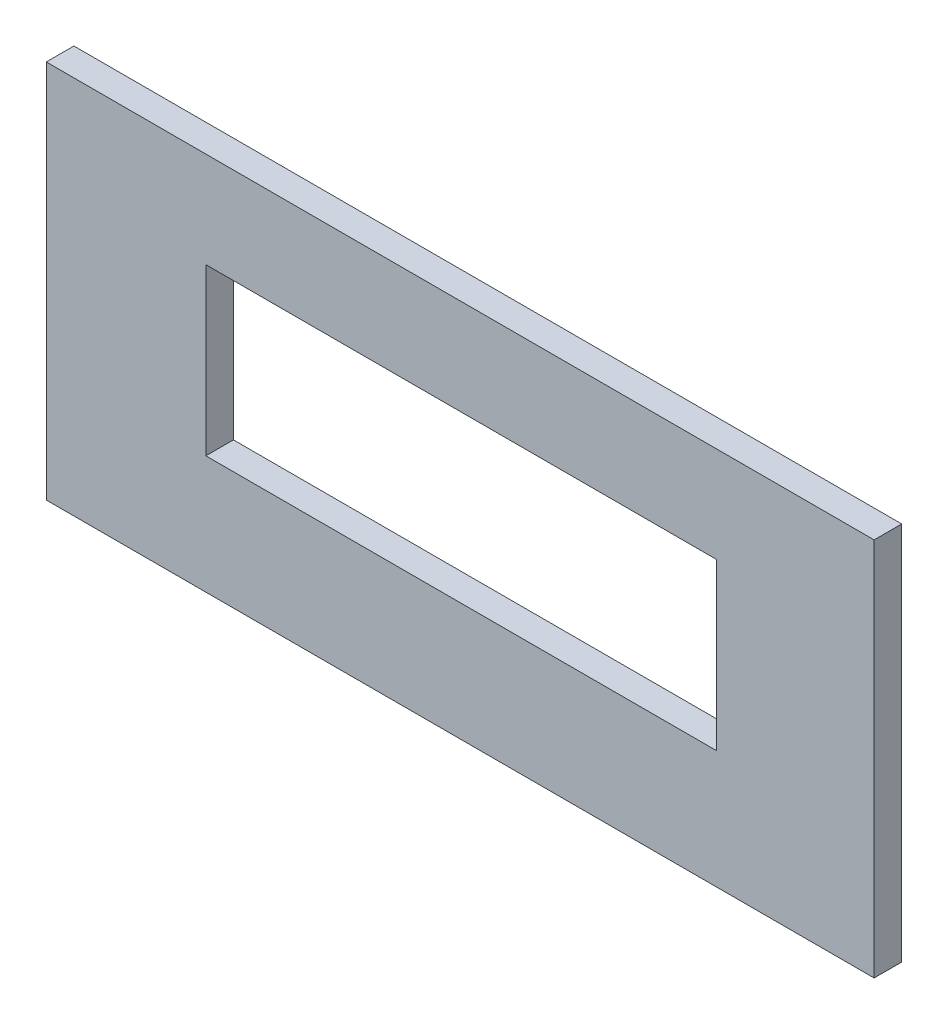
ISO-10303-21;
HEADER;
FILE_DESCRIPTION(('STEP AP214'),'2;1');
FILE_NAME('part.step','',(''),(''),'','','');
FILE_SCHEMA(('AUTOMOTIVE_DESIGN { 1 0 10303 214 1 1 1 1 }'));
ENDSEC;
DATA;
#1=APPLICATION_CONTEXT('core data for automotive mechanical design processes');
#2=APPLICATION_PROTOCOL_DEFINITION('international standard','automotive_design',2000,#1);
#3=PRODUCT_CONTEXT('',#1,'mechanical');
#4=PRODUCT('Part','Part','',(#3));
#5=PRODUCT_RELATED_PRODUCT_CATEGORY('part','',(#4));
#6=PRODUCT_DEFINITION_FORMATION('','',#4);
#7=PRODUCT_DEFINITION_CONTEXT('part definition',#1,'design');
#8=PRODUCT_DEFINITION('design','',#6,#7);
#9=PRODUCT_DEFINITION_SHAPE('','',#8);
#10=(LENGTH_UNIT() NAMED_UNIT(*) SI_UNIT(.MILLI.,.METRE.));
#11=(NAMED_UNIT(*) PLANE_ANGLE_UNIT() SI_UNIT($,.RADIAN.));
#12=(NAMED_UNIT(*) SI_UNIT($,.STERADIAN.) SOLID_ANGLE_UNIT());
#13=UNCERTAINTY_MEASURE_WITH_UNIT(LENGTH_MEASURE(1.E-05),#10,'distance_accuracy_value','');
#14=(GEOMETRIC_REPRESENTATION_CONTEXT(3) GLOBAL_UNCERTAINTY_ASSIGNED_CONTEXT((#13)) GLOBAL_UNIT_ASSIGNED_CONTEXT((#10,
#11,#12)) REPRESENTATION_CONTEXT('',''));
#15=CARTESIAN_POINT('',(0.,0.,0.));
#16=DIRECTION('',(0.,0.,1.));
#17=DIRECTION('',(1.,0.,0.));
#18=AXIS2_PLACEMENT_3D('',#15,#16,#17);
#19=CARTESIAN_POINT('',(0.,0.,4.));
#20=DIRECTION('',(-1.,0.,0.));
#21=DIRECTION('',(0.,-1.,0.));
#22=AXIS2_PLACEMENT_3D('',#19,#20,#21);
#23=PLANE('',#22);
#24=DIRECTION('',(0.,1.,0.));
#25=VECTOR('',#24,1.);
#26=CARTESIAN_POINT('',(0.,0.,0.));
#27=LINE('',#26,#25);
#28=CARTESIAN_POINT('',(0.,-55.,0.));
#29=VERTEX_POINT('',#28);
#30=CARTESIAN_POINT('',(0.,0.,0.));
#31=VERTEX_POINT('',#30);
#32=EDGE_CURVE('E130',#29,#31,#27,.T.);
#33=ORIENTED_EDGE('',*,*,#32,.T.);
#34=DIRECTION('',(0.,0.,-1.));
#35=VECTOR('',#34,1.);
#36=CARTESIAN_POINT('',(0.,0.,4.));
#37=LINE('',#36,#35);
#38=CARTESIAN_POINT('',(0.,0.,4.));
#39=VERTEX_POINT('',#38);
#40=EDGE_CURVE('E11',#39,#31,#37,.T.);
#41=ORIENTED_EDGE('',*,*,#40,.F.);
#42=DIRECTION('',(0.,1.,0.));
#43=VECTOR('',#42,1.);
#44=CARTESIAN_POINT('',(0.,0.,4.));
#45=LINE('',#44,#43);
#46=CARTESIAN_POINT('',(0.,-55.,4.));
#47=VERTEX_POINT('',#46);
#48=EDGE_CURVE('E134',#47,#39,#45,.T.);
#49=ORIENTED_EDGE('',*,*,#48,.F.);
#50=DIRECTION('',(0.,0.,-1.));
#51=VECTOR('',#50,1.);
#52=CARTESIAN_POINT('',(0.,-55.,4.));
#53=LINE('',#52,#51);
#54=EDGE_CURVE('E144',#47,#29,#53,.T.);
#55=ORIENTED_EDGE('',*,*,#54,.T.);
#56=EDGE_LOOP('',(#33,#41,#49,#55));
#57=FACE_BOUND('',#56,.T.);
#58=ADVANCED_FACE('F33',(#57),#23,.F.);
#59=CARTESIAN_POINT('',(0.,0.,4.));
#60=DIRECTION('',(0.,-1.,0.));
#61=DIRECTION('',(0.,0.,-1.));
#62=AXIS2_PLACEMENT_3D('',#59,#60,#61);
#63=PLANE('',#62);
#64=DIRECTION('',(-1.,0.,0.));
#65=VECTOR('',#64,1.);
#66=CARTESIAN_POINT('',(0.,0.,0.));
#67=LINE('',#66,#65);
#68=CARTESIAN_POINT('',(-120.,0.,0.));
#69=VERTEX_POINT('',#68);
#70=EDGE_CURVE('E147',#31,#69,#67,.T.);
#71=ORIENTED_EDGE('',*,*,#70,.T.);
#72=DIRECTION('',(0.,0.,-1.));
#73=VECTOR('',#72,1.);
#74=CARTESIAN_POINT('',(-120.,0.,4.));
#75=LINE('',#74,#73);
#76=CARTESIAN_POINT('',(-120.,0.,4.));
#77=VERTEX_POINT('',#76);
#78=EDGE_CURVE('E40',#77,#69,#75,.T.);
#79=ORIENTED_EDGE('',*,*,#78,.F.);
#80=DIRECTION('',(-1.,0.,0.));
#81=VECTOR('',#80,1.);
#82=CARTESIAN_POINT('',(0.,0.,4.));
#83=LINE('',#82,#81);
#84=EDGE_CURVE('E137',#39,#77,#83,.T.);
#85=ORIENTED_EDGE('',*,*,#84,.F.);
#86=ORIENTED_EDGE('',*,*,#40,.T.);
#87=EDGE_LOOP('',(#71,#79,#85,#86));
#88=FACE_BOUND('',#87,.T.);
#89=ADVANCED_FACE('F175',(#88),#63,.F.);
#90=CARTESIAN_POINT('',(-120.,0.,4.));
#91=DIRECTION('',(1.,0.,0.));
#92=DIRECTION('',(0.,1.,0.));
#93=AXIS2_PLACEMENT_3D('',#90,#91,#92);
#94=PLANE('',#93);
#95=DIRECTION('',(0.,-1.,0.));
#96=VECTOR('',#95,1.);
#97=CARTESIAN_POINT('',(-120.,0.,0.));
#98=LINE('',#97,#96);
#99=CARTESIAN_POINT('',(-120.,-55.,0.));
#100=VERTEX_POINT('',#99);
#101=EDGE_CURVE('E149',#69,#100,#98,.T.);
#102=ORIENTED_EDGE('',*,*,#101,.T.);
#103=DIRECTION('',(0.,0.,-1.));
#104=VECTOR('',#103,1.);
#105=CARTESIAN_POINT('',(-120.,-55.,4.));
#106=LINE('',#105,#104);
#107=CARTESIAN_POINT('',(-120.,-55.,4.));
#108=VERTEX_POINT('',#107);
#109=EDGE_CURVE('E154',#108,#100,#106,.T.);
#110=ORIENTED_EDGE('',*,*,#109,.F.);
#111=DIRECTION('',(0.,-1.,0.));
#112=VECTOR('',#111,1.);
#113=CARTESIAN_POINT('',(-120.,0.,4.));
#114=LINE('',#113,#112);
#115=EDGE_CURVE('E140',#77,#108,#114,.T.);
#116=ORIENTED_EDGE('',*,*,#115,.F.);
#117=ORIENTED_EDGE('',*,*,#78,.T.);
#118=EDGE_LOOP('',(#102,#110,#116,#117));
#119=FACE_BOUND('',#118,.T.);
#120=ADVANCED_FACE('F161',(#119),#94,.F.);
#121=CARTESIAN_POINT('',(0.,-55.,4.));
#122=DIRECTION('',(0.,1.,0.));
#123=DIRECTION('',(-1.,0.,0.));
#124=AXIS2_PLACEMENT_3D('',#121,#122,#123);
#125=PLANE('',#124);
#126=DIRECTION('',(1.,0.,0.));
#127=VECTOR('',#126,1.);
#128=CARTESIAN_POINT('',(0.,-55.,0.));
#129=LINE('',#128,#127);
#130=EDGE_CURVE('E138',#100,#29,#129,.T.);
#131=ORIENTED_EDGE('',*,*,#130,.T.);
#132=ORIENTED_EDGE('',*,*,#54,.F.);
#133=DIRECTION('',(1.,0.,0.));
#134=VECTOR('',#133,1.);
#135=CARTESIAN_POINT('',(0.,-55.,4.));
#136=LINE('',#135,#134);
#137=EDGE_CURVE('E142',#108,#47,#136,.T.);
#138=ORIENTED_EDGE('',*,*,#137,.F.);
#139=ORIENTED_EDGE('',*,*,#109,.T.);
#140=EDGE_LOOP('',(#131,#132,#138,#139));
#141=FACE_BOUND('',#140,.T.);
#142=ADVANCED_FACE('F168',(#141),#125,.F.);
#143=CARTESIAN_POINT('',(0.,0.,4.));
#144=DIRECTION('',(0.,0.,-1.));
#145=DIRECTION('',(-1.,0.,0.));
#146=AXIS2_PLACEMENT_3D('',#143,#144,#145);
#147=PLANE('',#146);
#148=DIRECTION('',(-1.,0.,0.));
#149=VECTOR('',#148,1.);
#150=CARTESIAN_POINT('',(-96.8706855182934,-13.8835689786682,4.));
#151=LINE('',#150,#149);
#152=CARTESIAN_POINT('',(-22.8706855182934,-13.8835689786682,4.));
#153=VERTEX_POINT('',#152);
#154=CARTESIAN_POINT('',(-96.8706855182934,-13.8835689786682,4.));
#155=VERTEX_POINT('',#154);
#156=EDGE_CURVE('E124',#153,#155,#151,.T.);
#157=ORIENTED_EDGE('',*,*,#156,.F.);
#158=DIRECTION('',(0.,1.,0.));
#159=VECTOR('',#158,1.);
#160=CARTESIAN_POINT('',(-22.8706855182934,-13.8835689786682,4.));
#161=LINE('',#160,#159);
#162=CARTESIAN_POINT('',(-22.8706855182934,-37.8835689786682,4.));
#163=VERTEX_POINT('',#162);
#164=EDGE_CURVE('E47',#163,#153,#161,.T.);
#165=ORIENTED_EDGE('',*,*,#164,.F.);
#166=DIRECTION('',(1.,0.,0.));
#167=VECTOR('',#166,1.);
#168=CARTESIAN_POINT('',(-96.8706855182934,-37.8835689786682,4.));
#169=LINE('',#168,#167);
#170=CARTESIAN_POINT('',(-96.8706855182934,-37.8835689786682,4.));
#171=VERTEX_POINT('',#170);
#172=EDGE_CURVE('E115',#171,#163,#169,.T.);
#173=ORIENTED_EDGE('',*,*,#172,.F.);
#174=DIRECTION('',(0.,-1.,0.));
#175=VECTOR('',#174,1.);
#176=CARTESIAN_POINT('',(-96.8706855182934,-13.8835689786682,4.));
#177=LINE('',#176,#175);
#178=EDGE_CURVE('E118',#155,#171,#177,.T.);
#179=ORIENTED_EDGE('',*,*,#178,.F.);
#180=EDGE_LOOP('',(#157,#165,#173,#179));
#181=FACE_BOUND('',#180,.T.);
#182=ORIENTED_EDGE('',*,*,#48,.T.);
#183=ORIENTED_EDGE('',*,*,#84,.T.);
#184=ORIENTED_EDGE('',*,*,#115,.T.);
#185=ORIENTED_EDGE('',*,*,#137,.T.);
#186=EDGE_LOOP('',(#182,#183,#184,#185));
#187=FACE_BOUND('',#186,.T.);
#188=ADVANCED_FACE('F174',(#181,#187),#147,.F.);
#189=CARTESIAN_POINT('',(0.,0.,0.));
#190=DIRECTION('',(0.,0.,-1.));
#191=DIRECTION('',(-1.,0.,0.));
#192=AXIS2_PLACEMENT_3D('',#189,#190,#191);
#193=PLANE('',#192);
#194=DIRECTION('',(0.,1.,0.));
#195=VECTOR('',#194,1.);
#196=CARTESIAN_POINT('',(-22.8706855182934,-13.8835689786682,0.));
#197=LINE('',#196,#195);
#198=CARTESIAN_POINT('',(-22.8706855182934,-37.8835689786682,0.));
#199=VERTEX_POINT('',#198);
#200=CARTESIAN_POINT('',(-22.8706855182934,-13.8835689786682,0.));
#201=VERTEX_POINT('',#200);
#202=EDGE_CURVE('E99',#199,#201,#197,.T.);
#203=ORIENTED_EDGE('',*,*,#202,.T.);
#204=DIRECTION('',(-1.,0.,0.));
#205=VECTOR('',#204,1.);
#206=CARTESIAN_POINT('',(-96.8706855182934,-13.8835689786682,0.));
#207=LINE('',#206,#205);
#208=CARTESIAN_POINT('',(-96.8706855182934,-13.8835689786682,0.));
#209=VERTEX_POINT('',#208);
#210=EDGE_CURVE('E108',#201,#209,#207,.T.);
#211=ORIENTED_EDGE('',*,*,#210,.T.);
#212=DIRECTION('',(0.,-1.,0.));
#213=VECTOR('',#212,1.);
#214=CARTESIAN_POINT('',(-96.8706855182934,-13.8835689786682,0.));
#215=LINE('',#214,#213);
#216=CARTESIAN_POINT('',(-96.8706855182934,-37.8835689786682,0.));
#217=VERTEX_POINT('',#216);
#218=EDGE_CURVE('E55',#209,#217,#215,.T.);
#219=ORIENTED_EDGE('',*,*,#218,.T.);
#220=DIRECTION('',(1.,0.,0.));
#221=VECTOR('',#220,1.);
#222=CARTESIAN_POINT('',(-96.8706855182934,-37.8835689786682,0.));
#223=LINE('',#222,#221);
#224=EDGE_CURVE('E105',#217,#199,#223,.T.);
#225=ORIENTED_EDGE('',*,*,#224,.T.);
#226=EDGE_LOOP('',(#203,#211,#219,#225));
#227=FACE_BOUND('',#226,.T.);
#228=ORIENTED_EDGE('',*,*,#32,.F.);
#229=ORIENTED_EDGE('',*,*,#130,.F.);
#230=ORIENTED_EDGE('',*,*,#101,.F.);
#231=ORIENTED_EDGE('',*,*,#70,.F.);
#232=EDGE_LOOP('',(#228,#229,#230,#231));
#233=FACE_BOUND('',#232,.T.);
#234=ADVANCED_FACE('F112',(#227,#233),#193,.T.);
#235=CARTESIAN_POINT('',(-22.8706855182934,-13.8835689786682,0.));
#236=DIRECTION('',(1.,0.,0.));
#237=DIRECTION('',(0.,0.,-1.));
#238=AXIS2_PLACEMENT_3D('',#235,#236,#237);
#239=PLANE('',#238);
#240=ORIENTED_EDGE('',*,*,#164,.T.);
#241=DIRECTION('',(0.,0.,1.));
#242=VECTOR('',#241,1.);
#243=CARTESIAN_POINT('',(-22.8706855182934,-13.8835689786682,0.));
#244=LINE('',#243,#242);
#245=EDGE_CURVE('E95',#201,#153,#244,.T.);
#246=ORIENTED_EDGE('',*,*,#245,.F.);
#247=ORIENTED_EDGE('',*,*,#202,.F.);
#248=DIRECTION('',(0.,0.,1.));
#249=VECTOR('',#248,1.);
#250=CARTESIAN_POINT('',(-22.8706855182934,-37.8835689786682,0.));
#251=LINE('',#250,#249);
#252=EDGE_CURVE('E128',#199,#163,#251,.T.);
#253=ORIENTED_EDGE('',*,*,#252,.T.);
#254=EDGE_LOOP('',(#240,#246,#247,#253));
#255=FACE_BOUND('',#254,.T.);
#256=ADVANCED_FACE('F97',(#255),#239,.F.);
#257=CARTESIAN_POINT('',(-96.8706855182934,-37.8835689786682,0.));
#258=DIRECTION('',(0.,-1.,0.));
#259=DIRECTION('',(0.,0.,-1.));
#260=AXIS2_PLACEMENT_3D('',#257,#258,#259);
#261=PLANE('',#260);
#262=ORIENTED_EDGE('',*,*,#172,.T.);
#263=ORIENTED_EDGE('',*,*,#252,.F.);
#264=ORIENTED_EDGE('',*,*,#224,.F.);
#265=DIRECTION('',(0.,0.,1.));
#266=VECTOR('',#265,1.);
#267=CARTESIAN_POINT('',(-96.8706855182934,-37.8835689786682,0.));
#268=LINE('',#267,#266);
#269=EDGE_CURVE('E131',#217,#171,#268,.T.);
#270=ORIENTED_EDGE('',*,*,#269,.T.);
#271=EDGE_LOOP('',(#262,#263,#264,#270));
#272=FACE_BOUND('',#271,.T.);
#273=ADVANCED_FACE('F192',(#272),#261,.F.);
#274=CARTESIAN_POINT('',(-96.8706855182934,-13.8835689786682,0.));
#275=DIRECTION('',(-1.,0.,0.));
#276=DIRECTION('',(0.,0.,1.));
#277=AXIS2_PLACEMENT_3D('',#274,#275,#276);
#278=PLANE('',#277);
#279=ORIENTED_EDGE('',*,*,#178,.T.);
#280=ORIENTED_EDGE('',*,*,#269,.F.);
#281=ORIENTED_EDGE('',*,*,#218,.F.);
#282=DIRECTION('',(0.,0.,1.));
#283=VECTOR('',#282,1.);
#284=CARTESIAN_POINT('',(-96.8706855182934,-13.8835689786682,0.));
#285=LINE('',#284,#283);
#286=EDGE_CURVE('E104',#209,#155,#285,.T.);
#287=ORIENTED_EDGE('',*,*,#286,.T.);
#288=EDGE_LOOP('',(#279,#280,#281,#287));
#289=FACE_BOUND('',#288,.T.);
#290=ADVANCED_FACE('F195',(#289),#278,.F.);
#291=CARTESIAN_POINT('',(-96.8706855182934,-13.8835689786682,0.));
#292=DIRECTION('',(0.,1.,0.));
#293=DIRECTION('',(0.,0.,1.));
#294=AXIS2_PLACEMENT_3D('',#291,#292,#293);
#295=PLANE('',#294);
#296=ORIENTED_EDGE('',*,*,#156,.T.);
#297=ORIENTED_EDGE('',*,*,#286,.F.);
#298=ORIENTED_EDGE('',*,*,#210,.F.);
#299=ORIENTED_EDGE('',*,*,#245,.T.);
#300=EDGE_LOOP('',(#296,#297,#298,#299));
#301=FACE_BOUND('',#300,.T.);
#302=ADVANCED_FACE('F109',(#301),#295,.F.);
#303=CLOSED_SHELL('',(#58,#89,#120,#142,#188,#234,#256,#273,#290,#302));
#304=MANIFOLD_SOLID_BREP('B2',#303);
#305=ADVANCED_BREP_SHAPE_REPRESENTATION('',(#18,#304),#14);
#306=SHAPE_DEFINITION_REPRESENTATION(#9,#305);
ENDSEC;
END-ISO-10303-21;
